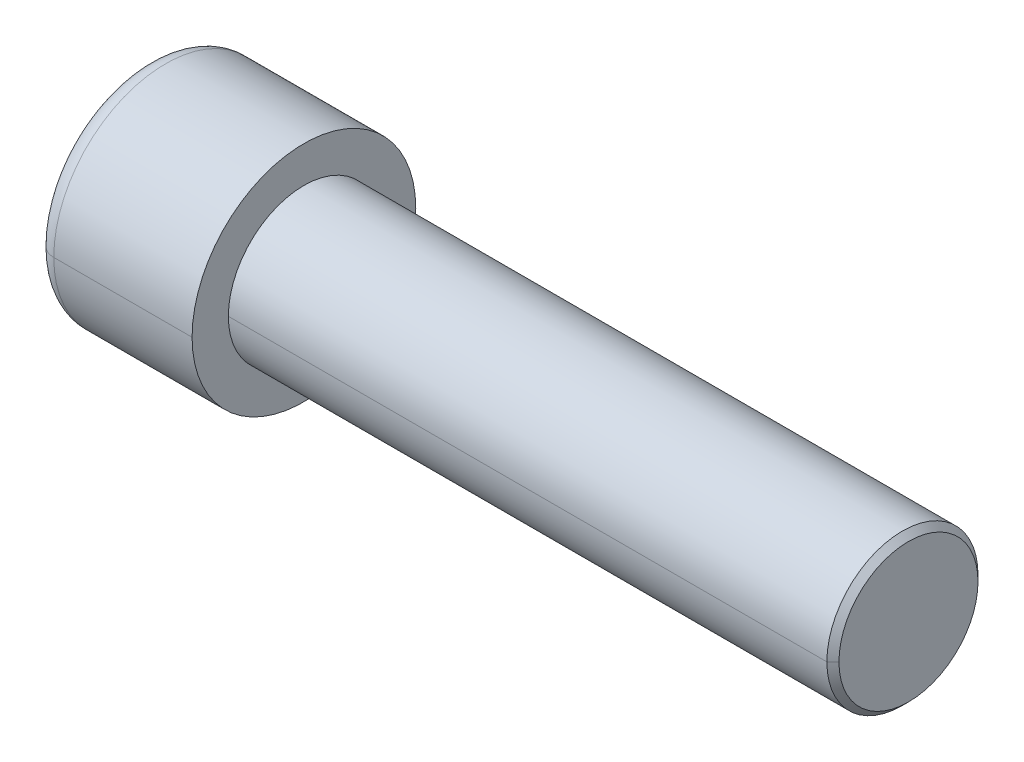
ISO-10303-21;
HEADER;
FILE_DESCRIPTION(('STEP AP214'),'2;1');
FILE_NAME('part.step','',(''),(''),'','','');
FILE_SCHEMA(('AUTOMOTIVE_DESIGN { 1 0 10303 214 1 1 1 1 }'));
ENDSEC;
DATA;
#1=APPLICATION_CONTEXT('core data for automotive mechanical design processes');
#2=APPLICATION_PROTOCOL_DEFINITION('international standard','automotive_design',2000,#1);
#3=PRODUCT_CONTEXT('',#1,'mechanical');
#4=PRODUCT('Part','Part','',(#3));
#5=PRODUCT_RELATED_PRODUCT_CATEGORY('part','',(#4));
#6=PRODUCT_DEFINITION_FORMATION('','',#4);
#7=PRODUCT_DEFINITION_CONTEXT('part definition',#1,'design');
#8=PRODUCT_DEFINITION('design','',#6,#7);
#9=PRODUCT_DEFINITION_SHAPE('','',#8);
#10=(LENGTH_UNIT() NAMED_UNIT(*) SI_UNIT(.MILLI.,.METRE.));
#11=(NAMED_UNIT(*) PLANE_ANGLE_UNIT() SI_UNIT($,.RADIAN.));
#12=(NAMED_UNIT(*) SI_UNIT($,.STERADIAN.) SOLID_ANGLE_UNIT());
#13=UNCERTAINTY_MEASURE_WITH_UNIT(LENGTH_MEASURE(1.E-05),#10,'distance_accuracy_value','');
#14=(GEOMETRIC_REPRESENTATION_CONTEXT(3) GLOBAL_UNCERTAINTY_ASSIGNED_CONTEXT((#13)) GLOBAL_UNIT_ASSIGNED_CONTEXT((#10,
#11,#12)) REPRESENTATION_CONTEXT('',''));
#15=CARTESIAN_POINT('',(0.,0.,0.));
#16=DIRECTION('',(0.,0.,1.));
#17=DIRECTION('',(1.,0.,0.));
#18=AXIS2_PLACEMENT_3D('',#15,#16,#17);
#19=CARTESIAN_POINT('',(12.6,0.,0.));
#20=DIRECTION('',(-1.,0.,0.));
#21=DIRECTION('',(0.,0.,1.));
#22=AXIS2_PLACEMENT_3D('',#19,#20,#21);
#23=CONICAL_SURFACE('',#22,1.15,0.785398163397442);
#24=CARTESIAN_POINT('',(12.6,0.,0.));
#25=DIRECTION('',(1.,0.,0.));
#26=DIRECTION('',(0.,0.,-1.));
#27=AXIS2_PLACEMENT_3D('',#24,#25,#26);
#28=CIRCLE('',#27,1.15);
#29=CARTESIAN_POINT('',(12.6,0.,-1.15));
#30=VERTEX_POINT('',#29);
#31=CARTESIAN_POINT('',(12.6,0.,1.15));
#32=VERTEX_POINT('',#31);
#33=EDGE_CURVE('E178',#30,#32,#28,.T.);
#34=ORIENTED_EDGE('',*,*,#33,.F.);
#35=DIRECTION('',(-0.707106781186552,0.,-0.707106781186544));
#36=VECTOR('',#35,1.);
#37=CARTESIAN_POINT('',(12.6,0.,-1.15));
#38=LINE('',#37,#36);
#39=CARTESIAN_POINT('',(12.5,0.,-1.25));
#40=VERTEX_POINT('',#39);
#41=EDGE_CURVE('E1002',#30,#40,#38,.T.);
#42=ORIENTED_EDGE('',*,*,#41,.T.);
#43=CARTESIAN_POINT('',(12.5,0.,0.));
#44=DIRECTION('',(-1.,0.,0.));
#45=DIRECTION('',(0.,0.,-1.));
#46=AXIS2_PLACEMENT_3D('',#43,#44,#45);
#47=CIRCLE('',#46,1.25);
#48=CARTESIAN_POINT('',(12.5,0.,1.25));
#49=VERTEX_POINT('',#48);
#50=EDGE_CURVE('E11',#49,#40,#47,.T.);
#51=ORIENTED_EDGE('',*,*,#50,.F.);
#52=DIRECTION('',(-0.707106781186552,0.,0.707106781186544));
#53=VECTOR('',#52,1.);
#54=CARTESIAN_POINT('',(12.6,0.,1.15));
#55=LINE('',#54,#53);
#56=EDGE_CURVE('E246',#32,#49,#55,.T.);
#57=ORIENTED_EDGE('',*,*,#56,.F.);
#58=EDGE_LOOP('',(#34,#42,#51,#57));
#59=FACE_BOUND('',#58,.T.);
#60=ADVANCED_FACE('F17',(#59),#23,.T.);
#61=CARTESIAN_POINT('',(0.3125,0.,0.));
#62=DIRECTION('',(1.,0.,0.));
#63=DIRECTION('',(0.,0.,-1.));
#64=AXIS2_PLACEMENT_3D('',#61,#62,#63);
#65=TOROIDAL_SURFACE('',#64,1.5375,0.3125);
#66=CARTESIAN_POINT('',(0.,0.,0.));
#67=DIRECTION('',(-1.,0.,0.));
#68=DIRECTION('',(0.,0.,-1.));
#69=AXIS2_PLACEMENT_3D('',#66,#67,#68);
#70=CIRCLE('',#69,1.5375);
#71=CARTESIAN_POINT('',(0.,0.,1.5375));
#72=VERTEX_POINT('',#71);
#73=CARTESIAN_POINT('',(0.,0.,-1.5375));
#74=VERTEX_POINT('',#73);
#75=EDGE_CURVE('E160',#72,#74,#70,.T.);
#76=ORIENTED_EDGE('',*,*,#75,.F.);
#77=CARTESIAN_POINT('',(0.3125,0.,1.5375));
#78=DIRECTION('',(0.,1.,0.));
#79=DIRECTION('',(0.,0.,1.));
#80=AXIS2_PLACEMENT_3D('',#77,#78,#79);
#81=CIRCLE('',#80,0.3125);
#82=CARTESIAN_POINT('',(0.3125,0.,1.85));
#83=VERTEX_POINT('',#82);
#84=EDGE_CURVE('E231',#72,#83,#81,.T.);
#85=ORIENTED_EDGE('',*,*,#84,.T.);
#86=CARTESIAN_POINT('',(0.3125,0.,0.));
#87=DIRECTION('',(1.,0.,0.));
#88=DIRECTION('',(0.,0.,-1.));
#89=AXIS2_PLACEMENT_3D('',#86,#87,#88);
#90=CIRCLE('',#89,1.85);
#91=CARTESIAN_POINT('',(0.3125,0.,-1.85));
#92=VERTEX_POINT('',#91);
#93=EDGE_CURVE('E20',#92,#83,#90,.T.);
#94=ORIENTED_EDGE('',*,*,#93,.F.);
#95=CARTESIAN_POINT('',(0.3125,0.,-1.5375));
#96=DIRECTION('',(0.,-1.,0.));
#97=DIRECTION('',(0.,0.,-1.));
#98=AXIS2_PLACEMENT_3D('',#95,#96,#97);
#99=CIRCLE('',#98,0.3125);
#100=EDGE_CURVE('E232',#74,#92,#99,.T.);
#101=ORIENTED_EDGE('',*,*,#100,.F.);
#102=EDGE_LOOP('',(#76,#85,#94,#101));
#103=FACE_BOUND('',#102,.T.);
#104=ADVANCED_FACE('F236',(#103),#65,.T.);
#105=CARTESIAN_POINT('',(1.,0.,0.));
#106=DIRECTION('',(-1.,0.,0.));
#107=DIRECTION('',(0.,0.,1.));
#108=AXIS2_PLACEMENT_3D('',#105,#106,#107);
#109=CONICAL_SURFACE('',#108,0.75,1.0471975511966);
#110=DIRECTION('',(-0.5,0.,0.866025403784438));
#111=VECTOR('',#110,1.);
#112=CARTESIAN_POINT('',(1.,0.,0.75));
#113=LINE('',#112,#111);
#114=CARTESIAN_POINT('',(1.43301270189222,0.,0.));
#115=VERTEX_POINT('',#114);
#116=CARTESIAN_POINT('',(1.,0.,0.75));
#117=VERTEX_POINT('',#116);
#118=EDGE_CURVE('E265',#115,#117,#113,.T.);
#119=ORIENTED_EDGE('',*,*,#118,.F.);
#120=DIRECTION('',(-0.5,0.,-0.866025403784438));
#121=VECTOR('',#120,1.);
#122=CARTESIAN_POINT('',(1.,0.,-0.75));
#123=LINE('',#122,#121);
#124=CARTESIAN_POINT('',(1.,0.,-0.75));
#125=VERTEX_POINT('',#124);
#126=EDGE_CURVE('E234',#115,#125,#123,.T.);
#127=ORIENTED_EDGE('',*,*,#126,.T.);
#128=CARTESIAN_POINT('',(1.,0.,0.));
#129=DIRECTION('',(-1.,0.,0.));
#130=DIRECTION('',(0.,0.,-1.));
#131=AXIS2_PLACEMENT_3D('',#128,#129,#130);
#132=CIRCLE('',#131,0.75);
#133=CARTESIAN_POINT('',(1.,-0.375,-0.649519052838329));
#134=VERTEX_POINT('',#133);
#135=EDGE_CURVE('E191',#125,#134,#132,.T.);
#136=ORIENTED_EDGE('',*,*,#135,.T.);
#137=CARTESIAN_POINT('',(1.,0.,0.));
#138=DIRECTION('',(-1.,0.,0.));
#139=DIRECTION('',(0.,0.,-1.));
#140=AXIS2_PLACEMENT_3D('',#137,#138,#139);
#141=CIRCLE('',#140,0.75);
#142=CARTESIAN_POINT('',(1.,-0.75,0.));
#143=VERTEX_POINT('',#142);
#144=EDGE_CURVE('E201',#134,#143,#141,.T.);
#145=ORIENTED_EDGE('',*,*,#144,.T.);
#146=CARTESIAN_POINT('',(1.,0.,0.));
#147=DIRECTION('',(-1.,0.,0.));
#148=DIRECTION('',(0.,0.,-1.));
#149=AXIS2_PLACEMENT_3D('',#146,#147,#148);
#150=CIRCLE('',#149,0.75);
#151=CARTESIAN_POINT('',(1.,-0.375,0.649519052838329));
#152=VERTEX_POINT('',#151);
#153=EDGE_CURVE('E198',#143,#152,#150,.T.);
#154=ORIENTED_EDGE('',*,*,#153,.T.);
#155=CARTESIAN_POINT('',(1.,0.,0.));
#156=DIRECTION('',(-1.,0.,0.));
#157=DIRECTION('',(0.,0.,-1.));
#158=AXIS2_PLACEMENT_3D('',#155,#156,#157);
#159=CIRCLE('',#158,0.75);
#160=EDGE_CURVE('E195',#152,#117,#159,.T.);
#161=ORIENTED_EDGE('',*,*,#160,.T.);
#162=EDGE_LOOP('',(#119,#127,#136,#145,#154,#161));
#163=FACE_BOUND('',#162,.T.);
#164=ADVANCED_FACE('F360',(#163),#109,.F.);
#165=CARTESIAN_POINT('',(12.6,0.,0.));
#166=DIRECTION('',(-1.,0.,0.));
#167=DIRECTION('',(0.,0.,1.));
#168=AXIS2_PLACEMENT_3D('',#165,#166,#167);
#169=CYLINDRICAL_SURFACE('',#168,1.25);
#170=ORIENTED_EDGE('',*,*,#50,.T.);
#171=DIRECTION('',(-1.,0.,0.));
#172=VECTOR('',#171,1.);
#173=CARTESIAN_POINT('',(12.6,0.,-1.25));
#174=LINE('',#173,#172);
#175=CARTESIAN_POINT('',(2.6,0.,-1.25));
#176=VERTEX_POINT('',#175);
#177=EDGE_CURVE('E156',#40,#176,#174,.T.);
#178=ORIENTED_EDGE('',*,*,#177,.T.);
#179=CARTESIAN_POINT('',(2.6,0.,0.));
#180=DIRECTION('',(1.,0.,0.));
#181=DIRECTION('',(0.,0.,-1.));
#182=AXIS2_PLACEMENT_3D('',#179,#180,#181);
#183=CIRCLE('',#182,1.25);
#184=CARTESIAN_POINT('',(2.6,0.,1.25));
#185=VERTEX_POINT('',#184);
#186=EDGE_CURVE('E149',#176,#185,#183,.T.);
#187=ORIENTED_EDGE('',*,*,#186,.T.);
#188=DIRECTION('',(-1.,0.,0.));
#189=VECTOR('',#188,1.);
#190=CARTESIAN_POINT('',(12.6,0.,1.25));
#191=LINE('',#190,#189);
#192=EDGE_CURVE('E153',#49,#185,#191,.T.);
#193=ORIENTED_EDGE('',*,*,#192,.F.);
#194=EDGE_LOOP('',(#170,#178,#187,#193));
#195=FACE_BOUND('',#194,.T.);
#196=ADVANCED_FACE('F151',(#195),#169,.T.);
#197=CARTESIAN_POINT('',(2.6,0.,0.));
#198=DIRECTION('',(-1.,0.,0.));
#199=DIRECTION('',(0.,0.,1.));
#200=AXIS2_PLACEMENT_3D('',#197,#198,#199);
#201=CYLINDRICAL_SURFACE('',#200,1.85);
#202=CARTESIAN_POINT('',(2.6,0.,0.));
#203=DIRECTION('',(1.,0.,0.));
#204=DIRECTION('',(0.,0.,-1.));
#205=AXIS2_PLACEMENT_3D('',#202,#203,#204);
#206=CIRCLE('',#205,1.85);
#207=CARTESIAN_POINT('',(2.6,0.,-1.85));
#208=VERTEX_POINT('',#207);
#209=CARTESIAN_POINT('',(2.6,0.,1.85));
#210=VERTEX_POINT('',#209);
#211=EDGE_CURVE('E38',#208,#210,#206,.T.);
#212=ORIENTED_EDGE('',*,*,#211,.F.);
#213=DIRECTION('',(-1.,0.,0.));
#214=VECTOR('',#213,1.);
#215=CARTESIAN_POINT('',(2.6,0.,-1.85));
#216=LINE('',#215,#214);
#217=EDGE_CURVE('E166',#208,#92,#216,.T.);
#218=ORIENTED_EDGE('',*,*,#217,.T.);
#219=ORIENTED_EDGE('',*,*,#93,.T.);
#220=DIRECTION('',(-1.,0.,0.));
#221=VECTOR('',#220,1.);
#222=CARTESIAN_POINT('',(2.6,0.,1.85));
#223=LINE('',#222,#221);
#224=EDGE_CURVE('E187',#210,#83,#223,.T.);
#225=ORIENTED_EDGE('',*,*,#224,.F.);
#226=EDGE_LOOP('',(#212,#218,#219,#225));
#227=FACE_BOUND('',#226,.T.);
#228=ADVANCED_FACE('F213',(#227),#201,.T.);
#229=CARTESIAN_POINT('',(1.,0.,-0.86602540378444));
#230=DIRECTION('',(1.,0.,0.));
#231=DIRECTION('',(0.,1.,0.));
#232=AXIS2_PLACEMENT_3D('',#229,#230,#231);
#233=PLANE('',#232);
#234=ORIENTED_EDGE('',*,*,#144,.F.);
#235=DIRECTION('',(0.,0.866025403784439,-0.5));
#236=VECTOR('',#235,1.);
#237=CARTESIAN_POINT('',(1.,-0.75,-0.433012701892222));
#238=LINE('',#237,#236);
#239=CARTESIAN_POINT('',(1.,-0.75,-0.433012701892222));
#240=VERTEX_POINT('',#239);
#241=EDGE_CURVE('E276',#240,#134,#238,.T.);
#242=ORIENTED_EDGE('',*,*,#241,.F.);
#243=DIRECTION('',(0.,0.,-1.));
#244=VECTOR('',#243,1.);
#245=CARTESIAN_POINT('',(1.,-0.75,0.433012701892218));
#246=LINE('',#245,#244);
#247=EDGE_CURVE('E297',#143,#240,#246,.T.);
#248=ORIENTED_EDGE('',*,*,#247,.F.);
#249=EDGE_LOOP('',(#234,#242,#248));
#250=FACE_BOUND('',#249,.T.);
#251=ADVANCED_FACE('F358',(#250),#233,.F.);
#252=CARTESIAN_POINT('',(1.,0.,-0.86602540378444));
#253=DIRECTION('',(1.,0.,0.));
#254=DIRECTION('',(0.,1.,0.));
#255=AXIS2_PLACEMENT_3D('',#252,#253,#254);
#256=PLANE('',#255);
#257=ORIENTED_EDGE('',*,*,#153,.F.);
#258=DIRECTION('',(0.,0.,-1.));
#259=VECTOR('',#258,1.);
#260=CARTESIAN_POINT('',(1.,-0.75,0.433012701892218));
#261=LINE('',#260,#259);
#262=CARTESIAN_POINT('',(1.,-0.75,0.433012701892218));
#263=VERTEX_POINT('',#262);
#264=EDGE_CURVE('E293',#263,#143,#261,.T.);
#265=ORIENTED_EDGE('',*,*,#264,.F.);
#266=DIRECTION('',(0.,-0.866025403784439,-0.5));
#267=VECTOR('',#266,1.);
#268=CARTESIAN_POINT('',(1.,0.,0.866025403784437));
#269=LINE('',#268,#267);
#270=EDGE_CURVE('E302',#152,#263,#269,.T.);
#271=ORIENTED_EDGE('',*,*,#270,.F.);
#272=EDGE_LOOP('',(#257,#265,#271));
#273=FACE_BOUND('',#272,.T.);
#274=ADVANCED_FACE('F782',(#273),#256,.F.);
#275=CARTESIAN_POINT('',(1.,0.,-0.86602540378444));
#276=DIRECTION('',(1.,0.,0.));
#277=DIRECTION('',(0.,1.,0.));
#278=AXIS2_PLACEMENT_3D('',#275,#276,#277);
#279=PLANE('',#278);
#280=ORIENTED_EDGE('',*,*,#160,.F.);
#281=DIRECTION('',(0.,-0.866025403784439,-0.5));
#282=VECTOR('',#281,1.);
#283=CARTESIAN_POINT('',(1.,0.,0.866025403784437));
#284=LINE('',#283,#282);
#285=CARTESIAN_POINT('',(1.,0.,0.866025403784437));
#286=VERTEX_POINT('',#285);
#287=EDGE_CURVE('E314',#286,#152,#284,.T.);
#288=ORIENTED_EDGE('',*,*,#287,.F.);
#289=DIRECTION('',(0.,-0.866025403784439,0.5));
#290=VECTOR('',#289,1.);
#291=CARTESIAN_POINT('',(1.,0.75,0.433012701892218));
#292=LINE('',#291,#290);
#293=CARTESIAN_POINT('',(1.,0.375,0.649519052838329));
#294=VERTEX_POINT('',#293);
#295=EDGE_CURVE('E309',#294,#286,#292,.T.);
#296=ORIENTED_EDGE('',*,*,#295,.F.);
#297=CARTESIAN_POINT('',(1.,0.,0.));
#298=DIRECTION('',(-1.,0.,0.));
#299=DIRECTION('',(0.,0.,-1.));
#300=AXIS2_PLACEMENT_3D('',#297,#298,#299);
#301=CIRCLE('',#300,0.75);
#302=EDGE_CURVE('E262',#117,#294,#301,.T.);
#303=ORIENTED_EDGE('',*,*,#302,.F.);
#304=EDGE_LOOP('',(#280,#288,#296,#303));
#305=FACE_BOUND('',#304,.T.);
#306=ADVANCED_FACE('F771',(#305),#279,.F.);
#307=CARTESIAN_POINT('',(1.,0.,-0.86602540378444));
#308=DIRECTION('',(1.,0.,0.));
#309=DIRECTION('',(0.,1.,0.));
#310=AXIS2_PLACEMENT_3D('',#307,#308,#309);
#311=PLANE('',#310);
#312=CARTESIAN_POINT('',(1.,0.,0.));
#313=DIRECTION('',(-1.,0.,0.));
#314=DIRECTION('',(0.,0.,-1.));
#315=AXIS2_PLACEMENT_3D('',#312,#313,#314);
#316=CIRCLE('',#315,0.75);
#317=CARTESIAN_POINT('',(1.,0.75,0.));
#318=VERTEX_POINT('',#317);
#319=EDGE_CURVE('E257',#294,#318,#316,.T.);
#320=ORIENTED_EDGE('',*,*,#319,.F.);
#321=DIRECTION('',(0.,-0.866025403784439,0.5));
#322=VECTOR('',#321,1.);
#323=CARTESIAN_POINT('',(1.,0.75,0.433012701892218));
#324=LINE('',#323,#322);
#325=CARTESIAN_POINT('',(1.,0.75,0.433012701892218));
#326=VERTEX_POINT('',#325);
#327=EDGE_CURVE('E313',#326,#294,#324,.T.);
#328=ORIENTED_EDGE('',*,*,#327,.F.);
#329=DIRECTION('',(0.,0.,1.));
#330=VECTOR('',#329,1.);
#331=CARTESIAN_POINT('',(1.,0.75,-0.43301270189222));
#332=LINE('',#331,#330);
#333=EDGE_CURVE('E333',#318,#326,#332,.T.);
#334=ORIENTED_EDGE('',*,*,#333,.F.);
#335=EDGE_LOOP('',(#320,#328,#334));
#336=FACE_BOUND('',#335,.T.);
#337=ADVANCED_FACE('F708',(#336),#311,.F.);
#338=CARTESIAN_POINT('',(1.,0.,-0.86602540378444));
#339=DIRECTION('',(1.,0.,0.));
#340=DIRECTION('',(0.,1.,0.));
#341=AXIS2_PLACEMENT_3D('',#338,#339,#340);
#342=PLANE('',#341);
#343=CARTESIAN_POINT('',(1.,0.,0.));
#344=DIRECTION('',(1.,0.,0.));
#345=DIRECTION('',(0.,0.,-1.));
#346=AXIS2_PLACEMENT_3D('',#343,#344,#345);
#347=CIRCLE('',#346,0.75);
#348=CARTESIAN_POINT('',(1.,0.375,-0.64951905283833));
#349=VERTEX_POINT('',#348);
#350=EDGE_CURVE('E261',#349,#318,#347,.T.);
#351=ORIENTED_EDGE('',*,*,#350,.T.);
#352=DIRECTION('',(0.,0.,1.));
#353=VECTOR('',#352,1.);
#354=CARTESIAN_POINT('',(1.,0.75,-0.43301270189222));
#355=LINE('',#354,#353);
#356=CARTESIAN_POINT('',(1.,0.75,-0.43301270189222));
#357=VERTEX_POINT('',#356);
#358=EDGE_CURVE('E329',#357,#318,#355,.T.);
#359=ORIENTED_EDGE('',*,*,#358,.F.);
#360=DIRECTION('',(0.,0.866025403784439,0.5));
#361=VECTOR('',#360,1.);
#362=CARTESIAN_POINT('',(1.,0.,-0.86602540378444));
#363=LINE('',#362,#361);
#364=EDGE_CURVE('E254',#349,#357,#363,.T.);
#365=ORIENTED_EDGE('',*,*,#364,.F.);
#366=EDGE_LOOP('',(#351,#359,#365));
#367=FACE_BOUND('',#366,.T.);
#368=ADVANCED_FACE('F703',(#367),#342,.F.);
#369=CARTESIAN_POINT('',(1.,0.,-0.86602540378444));
#370=DIRECTION('',(1.,0.,0.));
#371=DIRECTION('',(0.,1.,0.));
#372=AXIS2_PLACEMENT_3D('',#369,#370,#371);
#373=PLANE('',#372);
#374=CARTESIAN_POINT('',(1.,0.,0.));
#375=DIRECTION('',(-1.,0.,0.));
#376=DIRECTION('',(0.,0.,-1.));
#377=AXIS2_PLACEMENT_3D('',#374,#375,#376);
#378=CIRCLE('',#377,0.75);
#379=EDGE_CURVE('E272',#349,#125,#378,.T.);
#380=ORIENTED_EDGE('',*,*,#379,.F.);
#381=DIRECTION('',(0.,0.866025403784439,0.5));
#382=VECTOR('',#381,1.);
#383=CARTESIAN_POINT('',(1.,0.,-0.86602540378444));
#384=LINE('',#383,#382);
#385=CARTESIAN_POINT('',(1.,0.,-0.86602540378444));
#386=VERTEX_POINT('',#385);
#387=EDGE_CURVE('E251',#386,#349,#384,.T.);
#388=ORIENTED_EDGE('',*,*,#387,.F.);
#389=DIRECTION('',(0.,0.866025403784439,-0.5));
#390=VECTOR('',#389,1.);
#391=CARTESIAN_POINT('',(1.,-0.75,-0.433012701892222));
#392=LINE('',#391,#390);
#393=EDGE_CURVE('E273',#134,#386,#392,.T.);
#394=ORIENTED_EDGE('',*,*,#393,.F.);
#395=ORIENTED_EDGE('',*,*,#135,.F.);
#396=EDGE_LOOP('',(#380,#388,#394,#395));
#397=FACE_BOUND('',#396,.T.);
#398=ADVANCED_FACE('F364',(#397),#373,.F.);
#399=CARTESIAN_POINT('',(0.,0.,0.));
#400=DIRECTION('',(1.,0.,0.));
#401=DIRECTION('',(0.,1.,0.));
#402=AXIS2_PLACEMENT_3D('',#399,#400,#401);
#403=PLANE('',#402);
#404=DIRECTION('',(0.,0.866025403784439,-0.5));
#405=VECTOR('',#404,1.);
#406=CARTESIAN_POINT('',(0.,-0.75,-0.433012701892222));
#407=LINE('',#406,#405);
#408=CARTESIAN_POINT('',(0.,-0.75,-0.433012701892222));
#409=VERTEX_POINT('',#408);
#410=CARTESIAN_POINT('',(0.,0.,-0.86602540378444));
#411=VERTEX_POINT('',#410);
#412=EDGE_CURVE('E344',#409,#411,#407,.T.);
#413=ORIENTED_EDGE('',*,*,#412,.T.);
#414=DIRECTION('',(0.,0.866025403784439,0.5));
#415=VECTOR('',#414,1.);
#416=CARTESIAN_POINT('',(0.,0.,-0.86602540378444));
#417=LINE('',#416,#415);
#418=CARTESIAN_POINT('',(0.,0.75,-0.43301270189222));
#419=VERTEX_POINT('',#418);
#420=EDGE_CURVE('E336',#411,#419,#417,.T.);
#421=ORIENTED_EDGE('',*,*,#420,.T.);
#422=DIRECTION('',(0.,0.,1.));
#423=VECTOR('',#422,1.);
#424=CARTESIAN_POINT('',(0.,0.75,-0.43301270189222));
#425=LINE('',#424,#423);
#426=CARTESIAN_POINT('',(0.,0.75,0.433012701892218));
#427=VERTEX_POINT('',#426);
#428=EDGE_CURVE('E312',#419,#427,#425,.T.);
#429=ORIENTED_EDGE('',*,*,#428,.T.);
#430=DIRECTION('',(0.,-0.866025403784439,0.5));
#431=VECTOR('',#430,1.);
#432=CARTESIAN_POINT('',(0.,0.75,0.433012701892218));
#433=LINE('',#432,#431);
#434=CARTESIAN_POINT('',(0.,0.,0.866025403784437));
#435=VERTEX_POINT('',#434);
#436=EDGE_CURVE('E298',#427,#435,#433,.T.);
#437=ORIENTED_EDGE('',*,*,#436,.T.);
#438=DIRECTION('',(0.,-0.866025403784439,-0.5));
#439=VECTOR('',#438,1.);
#440=CARTESIAN_POINT('',(0.,0.,0.866025403784437));
#441=LINE('',#440,#439);
#442=CARTESIAN_POINT('',(0.,-0.75,0.433012701892218));
#443=VERTEX_POINT('',#442);
#444=EDGE_CURVE('E277',#435,#443,#441,.T.);
#445=ORIENTED_EDGE('',*,*,#444,.T.);
#446=DIRECTION('',(0.,0.,-1.));
#447=VECTOR('',#446,1.);
#448=CARTESIAN_POINT('',(0.,-0.75,0.433012701892218));
#449=LINE('',#448,#447);
#450=EDGE_CURVE('E288',#443,#409,#449,.T.);
#451=ORIENTED_EDGE('',*,*,#450,.T.);
#452=EDGE_LOOP('',(#413,#421,#429,#437,#445,#451));
#453=FACE_BOUND('',#452,.T.);
#454=CARTESIAN_POINT('',(0.,0.,0.));
#455=DIRECTION('',(-1.,0.,0.));
#456=DIRECTION('',(0.,0.,-1.));
#457=AXIS2_PLACEMENT_3D('',#454,#455,#456);
#458=CIRCLE('',#457,1.5375);
#459=EDGE_CURVE('E239',#74,#72,#458,.T.);
#460=ORIENTED_EDGE('',*,*,#459,.T.);
#461=ORIENTED_EDGE('',*,*,#75,.T.);
#462=EDGE_LOOP('',(#460,#461));
#463=FACE_BOUND('',#462,.T.);
#464=ADVANCED_FACE('F377',(#453,#463),#403,.F.);
#465=CARTESIAN_POINT('',(2.6,0.,0.));
#466=DIRECTION('',(1.,0.,0.));
#467=DIRECTION('',(0.,1.,0.));
#468=AXIS2_PLACEMENT_3D('',#465,#466,#467);
#469=PLANE('',#468);
#470=CARTESIAN_POINT('',(2.6,0.,0.));
#471=DIRECTION('',(1.,0.,0.));
#472=DIRECTION('',(0.,0.,-1.));
#473=AXIS2_PLACEMENT_3D('',#470,#471,#472);
#474=CIRCLE('',#473,1.25);
#475=EDGE_CURVE('E162',#185,#176,#474,.T.);
#476=ORIENTED_EDGE('',*,*,#475,.F.);
#477=ORIENTED_EDGE('',*,*,#186,.F.);
#478=EDGE_LOOP('',(#476,#477));
#479=FACE_BOUND('',#478,.T.);
#480=CARTESIAN_POINT('',(2.6,0.,0.));
#481=DIRECTION('',(1.,0.,0.));
#482=DIRECTION('',(0.,0.,-1.));
#483=AXIS2_PLACEMENT_3D('',#480,#481,#482);
#484=CIRCLE('',#483,1.85);
#485=EDGE_CURVE('E185',#210,#208,#484,.T.);
#486=ORIENTED_EDGE('',*,*,#485,.T.);
#487=ORIENTED_EDGE('',*,*,#211,.T.);
#488=EDGE_LOOP('',(#486,#487));
#489=FACE_BOUND('',#488,.T.);
#490=ADVANCED_FACE('F163',(#479,#489),#469,.T.);
#491=CARTESIAN_POINT('',(2.6,0.,0.));
#492=DIRECTION('',(-1.,0.,0.));
#493=DIRECTION('',(0.,0.,1.));
#494=AXIS2_PLACEMENT_3D('',#491,#492,#493);
#495=CYLINDRICAL_SURFACE('',#494,1.85);
#496=ORIENTED_EDGE('',*,*,#217,.F.);
#497=ORIENTED_EDGE('',*,*,#485,.F.);
#498=ORIENTED_EDGE('',*,*,#224,.T.);
#499=CARTESIAN_POINT('',(0.3125,0.,0.));
#500=DIRECTION('',(1.,0.,0.));
#501=DIRECTION('',(0.,0.,-1.));
#502=AXIS2_PLACEMENT_3D('',#499,#500,#501);
#503=CIRCLE('',#502,1.85);
#504=EDGE_CURVE('E223',#83,#92,#503,.T.);
#505=ORIENTED_EDGE('',*,*,#504,.T.);
#506=EDGE_LOOP('',(#496,#497,#498,#505));
#507=FACE_BOUND('',#506,.T.);
#508=ADVANCED_FACE('F222',(#507),#495,.T.);
#509=CARTESIAN_POINT('',(12.6,0.,0.));
#510=DIRECTION('',(-1.,0.,0.));
#511=DIRECTION('',(0.,0.,1.));
#512=AXIS2_PLACEMENT_3D('',#509,#510,#511);
#513=CYLINDRICAL_SURFACE('',#512,1.25);
#514=ORIENTED_EDGE('',*,*,#177,.F.);
#515=CARTESIAN_POINT('',(12.5,0.,0.));
#516=DIRECTION('',(-1.,0.,0.));
#517=DIRECTION('',(0.,0.,-1.));
#518=AXIS2_PLACEMENT_3D('',#515,#516,#517);
#519=CIRCLE('',#518,1.25);
#520=EDGE_CURVE('E170',#40,#49,#519,.T.);
#521=ORIENTED_EDGE('',*,*,#520,.T.);
#522=ORIENTED_EDGE('',*,*,#192,.T.);
#523=ORIENTED_EDGE('',*,*,#475,.T.);
#524=EDGE_LOOP('',(#514,#521,#522,#523));
#525=FACE_BOUND('',#524,.T.);
#526=ADVANCED_FACE('F168',(#525),#513,.T.);
#527=CARTESIAN_POINT('',(12.6,0.,0.));
#528=DIRECTION('',(1.,0.,0.));
#529=DIRECTION('',(0.,1.,0.));
#530=AXIS2_PLACEMENT_3D('',#527,#528,#529);
#531=PLANE('',#530);
#532=CARTESIAN_POINT('',(12.6,0.,0.));
#533=DIRECTION('',(1.,0.,0.));
#534=DIRECTION('',(0.,0.,-1.));
#535=AXIS2_PLACEMENT_3D('',#532,#533,#534);
#536=CIRCLE('',#535,1.15);
#537=EDGE_CURVE('E1004',#32,#30,#536,.T.);
#538=ORIENTED_EDGE('',*,*,#537,.T.);
#539=ORIENTED_EDGE('',*,*,#33,.T.);
#540=EDGE_LOOP('',(#538,#539));
#541=FACE_BOUND('',#540,.T.);
#542=ADVANCED_FACE('F682',(#541),#531,.T.);
#543=CARTESIAN_POINT('',(1.,-0.75,-0.433012701892222));
#544=DIRECTION('',(0.,0.5,0.866025403784439));
#545=DIRECTION('',(1.,0.,0.));
#546=AXIS2_PLACEMENT_3D('',#543,#544,#545);
#547=PLANE('',#546);
#548=ORIENTED_EDGE('',*,*,#412,.F.);
#549=DIRECTION('',(-1.,0.,0.));
#550=VECTOR('',#549,1.);
#551=CARTESIAN_POINT('',(1.,-0.75,-0.433012701892222));
#552=LINE('',#551,#550);
#553=EDGE_CURVE('E281',#240,#409,#552,.T.);
#554=ORIENTED_EDGE('',*,*,#553,.F.);
#555=ORIENTED_EDGE('',*,*,#241,.T.);
#556=ORIENTED_EDGE('',*,*,#393,.T.);
#557=DIRECTION('',(-1.,0.,0.));
#558=VECTOR('',#557,1.);
#559=CARTESIAN_POINT('',(1.,0.,-0.86602540378444));
#560=LINE('',#559,#558);
#561=EDGE_CURVE('E255',#386,#411,#560,.T.);
#562=ORIENTED_EDGE('',*,*,#561,.T.);
#563=EDGE_LOOP('',(#548,#554,#555,#556,#562));
#564=FACE_BOUND('',#563,.T.);
#565=ADVANCED_FACE('F353',(#564),#547,.T.);
#566=CARTESIAN_POINT('',(1.,0.,-0.86602540378444));
#567=DIRECTION('',(0.,-0.5,0.866025403784439));
#568=DIRECTION('',(-1.,0.,0.));
#569=AXIS2_PLACEMENT_3D('',#566,#567,#568);
#570=PLANE('',#569);
#571=ORIENTED_EDGE('',*,*,#420,.F.);
#572=ORIENTED_EDGE('',*,*,#561,.F.);
#573=ORIENTED_EDGE('',*,*,#387,.T.);
#574=ORIENTED_EDGE('',*,*,#364,.T.);
#575=DIRECTION('',(-1.,0.,0.));
#576=VECTOR('',#575,1.);
#577=CARTESIAN_POINT('',(1.,0.75,-0.43301270189222));
#578=LINE('',#577,#576);
#579=EDGE_CURVE('E328',#357,#419,#578,.T.);
#580=ORIENTED_EDGE('',*,*,#579,.T.);
#581=EDGE_LOOP('',(#571,#572,#573,#574,#580));
#582=FACE_BOUND('',#581,.T.);
#583=ADVANCED_FACE('F369',(#582),#570,.T.);
#584=CARTESIAN_POINT('',(1.,0.75,-0.43301270189222));
#585=DIRECTION('',(0.,-1.,0.));
#586=DIRECTION('',(0.,0.,-1.));
#587=AXIS2_PLACEMENT_3D('',#584,#585,#586);
#588=PLANE('',#587);
#589=ORIENTED_EDGE('',*,*,#428,.F.);
#590=ORIENTED_EDGE('',*,*,#579,.F.);
#591=ORIENTED_EDGE('',*,*,#358,.T.);
#592=ORIENTED_EDGE('',*,*,#333,.T.);
#593=DIRECTION('',(-1.,0.,0.));
#594=VECTOR('',#593,1.);
#595=CARTESIAN_POINT('',(1.,0.75,0.433012701892218));
#596=LINE('',#595,#594);
#597=EDGE_CURVE('E301',#326,#427,#596,.T.);
#598=ORIENTED_EDGE('',*,*,#597,.T.);
#599=EDGE_LOOP('',(#589,#590,#591,#592,#598));
#600=FACE_BOUND('',#599,.T.);
#601=ADVANCED_FACE('F625',(#600),#588,.T.);
#602=CARTESIAN_POINT('',(1.,0.75,0.433012701892218));
#603=DIRECTION('',(0.,-0.5,-0.866025403784439));
#604=DIRECTION('',(0.,-0.866025403784439,0.5));
#605=AXIS2_PLACEMENT_3D('',#602,#603,#604);
#606=PLANE('',#605);
#607=ORIENTED_EDGE('',*,*,#436,.F.);
#608=ORIENTED_EDGE('',*,*,#597,.F.);
#609=ORIENTED_EDGE('',*,*,#327,.T.);
#610=ORIENTED_EDGE('',*,*,#295,.T.);
#611=DIRECTION('',(-1.,0.,0.));
#612=VECTOR('',#611,1.);
#613=CARTESIAN_POINT('',(1.,0.,0.866025403784437));
#614=LINE('',#613,#612);
#615=EDGE_CURVE('E280',#286,#435,#614,.T.);
#616=ORIENTED_EDGE('',*,*,#615,.T.);
#617=EDGE_LOOP('',(#607,#608,#609,#610,#616));
#618=FACE_BOUND('',#617,.T.);
#619=ADVANCED_FACE('F619',(#618),#606,.T.);
#620=CARTESIAN_POINT('',(1.,0.,0.866025403784437));
#621=DIRECTION('',(0.,0.5,-0.866025403784439));
#622=DIRECTION('',(-1.,0.,0.));
#623=AXIS2_PLACEMENT_3D('',#620,#621,#622);
#624=PLANE('',#623);
#625=ORIENTED_EDGE('',*,*,#444,.F.);
#626=ORIENTED_EDGE('',*,*,#615,.F.);
#627=ORIENTED_EDGE('',*,*,#287,.T.);
#628=ORIENTED_EDGE('',*,*,#270,.T.);
#629=DIRECTION('',(-1.,0.,0.));
#630=VECTOR('',#629,1.);
#631=CARTESIAN_POINT('',(1.,-0.75,0.433012701892218));
#632=LINE('',#631,#630);
#633=EDGE_CURVE('E289',#263,#443,#632,.T.);
#634=ORIENTED_EDGE('',*,*,#633,.T.);
#635=EDGE_LOOP('',(#625,#626,#627,#628,#634));
#636=FACE_BOUND('',#635,.T.);
#637=ADVANCED_FACE('F624',(#636),#624,.T.);
#638=CARTESIAN_POINT('',(1.,-0.75,0.433012701892218));
#639=DIRECTION('',(0.,1.,0.));
#640=DIRECTION('',(1.,0.,0.));
#641=AXIS2_PLACEMENT_3D('',#638,#639,#640);
#642=PLANE('',#641);
#643=ORIENTED_EDGE('',*,*,#450,.F.);
#644=ORIENTED_EDGE('',*,*,#633,.F.);
#645=ORIENTED_EDGE('',*,*,#264,.T.);
#646=ORIENTED_EDGE('',*,*,#247,.T.);
#647=ORIENTED_EDGE('',*,*,#553,.T.);
#648=EDGE_LOOP('',(#643,#644,#645,#646,#647));
#649=FACE_BOUND('',#648,.T.);
#650=ADVANCED_FACE('F375',(#649),#642,.T.);
#651=CARTESIAN_POINT('',(1.,0.,0.));
#652=DIRECTION('',(-1.,0.,0.));
#653=DIRECTION('',(0.,0.,1.));
#654=AXIS2_PLACEMENT_3D('',#651,#652,#653);
#655=CONICAL_SURFACE('',#654,0.75,1.0471975511966);
#656=ORIENTED_EDGE('',*,*,#126,.F.);
#657=ORIENTED_EDGE('',*,*,#118,.T.);
#658=ORIENTED_EDGE('',*,*,#302,.T.);
#659=ORIENTED_EDGE('',*,*,#319,.T.);
#660=ORIENTED_EDGE('',*,*,#350,.F.);
#661=ORIENTED_EDGE('',*,*,#379,.T.);
#662=EDGE_LOOP('',(#656,#657,#658,#659,#660,#661));
#663=FACE_BOUND('',#662,.T.);
#664=ADVANCED_FACE('F612',(#663),#655,.F.);
#665=CARTESIAN_POINT('',(0.3125,0.,0.));
#666=DIRECTION('',(1.,0.,0.));
#667=DIRECTION('',(0.,0.,-1.));
#668=AXIS2_PLACEMENT_3D('',#665,#666,#667);
#669=TOROIDAL_SURFACE('',#668,1.5375,0.3125);
#670=ORIENTED_EDGE('',*,*,#84,.F.);
#671=ORIENTED_EDGE('',*,*,#459,.F.);
#672=ORIENTED_EDGE('',*,*,#100,.T.);
#673=ORIENTED_EDGE('',*,*,#504,.F.);
#674=EDGE_LOOP('',(#670,#671,#672,#673));
#675=FACE_BOUND('',#674,.T.);
#676=ADVANCED_FACE('F229',(#675),#669,.T.);
#677=CARTESIAN_POINT('',(12.6,0.,0.));
#678=DIRECTION('',(-1.,0.,0.));
#679=DIRECTION('',(0.,0.,1.));
#680=AXIS2_PLACEMENT_3D('',#677,#678,#679);
#681=CONICAL_SURFACE('',#680,1.15,0.785398163397442);
#682=ORIENTED_EDGE('',*,*,#41,.F.);
#683=ORIENTED_EDGE('',*,*,#537,.F.);
#684=ORIENTED_EDGE('',*,*,#56,.T.);
#685=ORIENTED_EDGE('',*,*,#520,.F.);
#686=EDGE_LOOP('',(#682,#683,#684,#685));
#687=FACE_BOUND('',#686,.T.);
#688=ADVANCED_FACE('F598',(#687),#681,.T.);
#689=CLOSED_SHELL('',(#60,#104,#164,#196,#228,#251,#274,#306,#337,#368,#398,#464,#490,#508,#526,
#542,#565,#583,#601,#619,#637,#650,#664,#676,#688));
#690=MANIFOLD_SOLID_BREP('B1',#689);
#691=ADVANCED_BREP_SHAPE_REPRESENTATION('',(#18,#690),#14);
#692=SHAPE_DEFINITION_REPRESENTATION(#9,#691);
ENDSEC;
END-ISO-10303-21;
